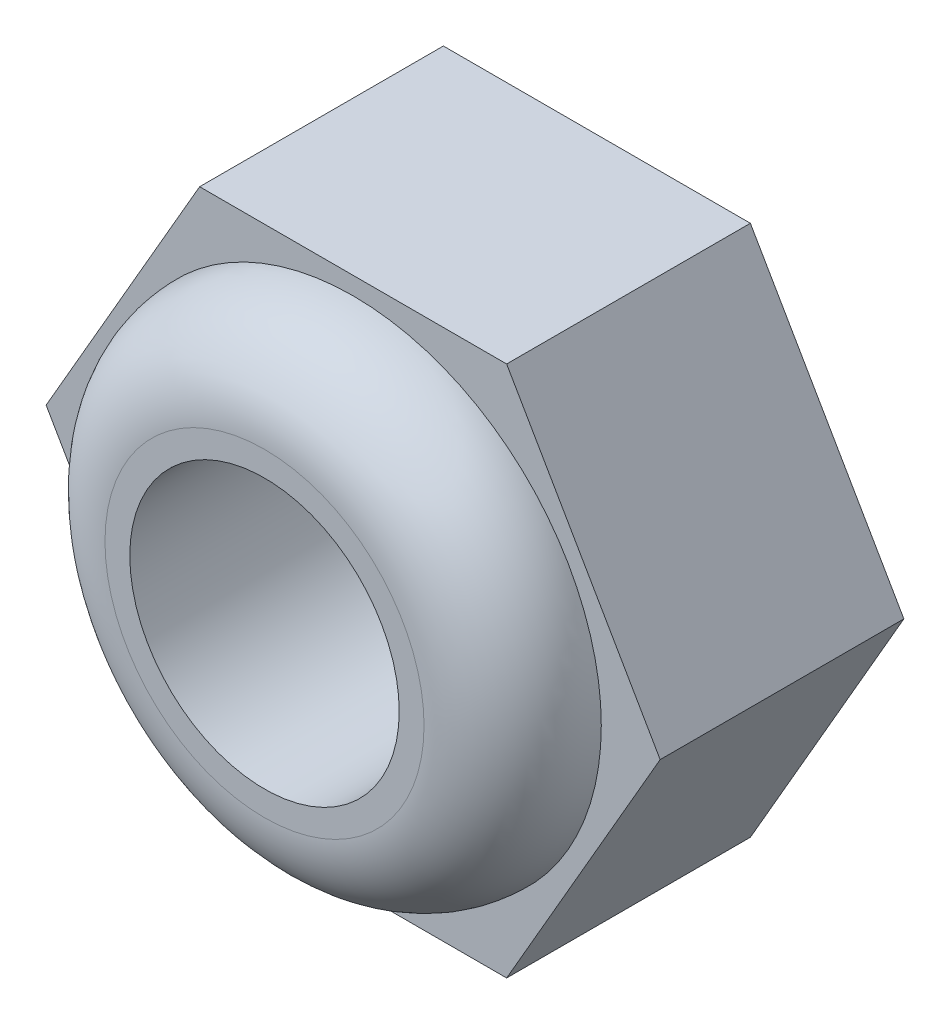
ISO-10303-21;
HEADER;
FILE_DESCRIPTION(('STEP AP214'),'2;1');
FILE_NAME('part.step','',(''),(''),'','','');
FILE_SCHEMA(('AUTOMOTIVE_DESIGN { 1 0 10303 214 1 1 1 1 }'));
ENDSEC;
DATA;
#1=APPLICATION_CONTEXT('core data for automotive mechanical design processes');
#2=APPLICATION_PROTOCOL_DEFINITION('international standard','automotive_design',2000,#1);
#3=PRODUCT_CONTEXT('',#1,'mechanical');
#4=PRODUCT('Part','Part','',(#3));
#5=PRODUCT_RELATED_PRODUCT_CATEGORY('part','',(#4));
#6=PRODUCT_DEFINITION_FORMATION('','',#4);
#7=PRODUCT_DEFINITION_CONTEXT('part definition',#1,'design');
#8=PRODUCT_DEFINITION('design','',#6,#7);
#9=PRODUCT_DEFINITION_SHAPE('','',#8);
#10=(LENGTH_UNIT() NAMED_UNIT(*) SI_UNIT(.MILLI.,.METRE.));
#11=(NAMED_UNIT(*) PLANE_ANGLE_UNIT() SI_UNIT($,.RADIAN.));
#12=(NAMED_UNIT(*) SI_UNIT($,.STERADIAN.) SOLID_ANGLE_UNIT());
#13=UNCERTAINTY_MEASURE_WITH_UNIT(LENGTH_MEASURE(1.E-05),#10,'distance_accuracy_value','');
#14=(GEOMETRIC_REPRESENTATION_CONTEXT(3) GLOBAL_UNCERTAINTY_ASSIGNED_CONTEXT((#13)) GLOBAL_UNIT_ASSIGNED_CONTEXT((#10,
#11,#12)) REPRESENTATION_CONTEXT('',''));
#15=CARTESIAN_POINT('',(0.,0.,0.));
#16=DIRECTION('',(0.,0.,1.));
#17=DIRECTION('',(1.,0.,0.));
#18=AXIS2_PLACEMENT_3D('',#15,#16,#17);
#19=CARTESIAN_POINT('',(0.,0.,4.365625));
#20=DIRECTION('',(0.,0.,1.));
#21=DIRECTION('',(1.,0.,0.));
#22=AXIS2_PLACEMENT_3D('',#19,#20,#21);
#23=PLANE('',#22);
#24=CARTESIAN_POINT('',(0.,0.,4.365625));
#25=DIRECTION('',(0.,0.,-1.));
#26=DIRECTION('',(-1.,0.,0.));
#27=AXIS2_PLACEMENT_3D('',#24,#25,#26);
#28=CIRCLE('',#27,4.445);
#29=CARTESIAN_POINT('',(-4.445,0.,4.365625));
#30=VERTEX_POINT('',#29);
#31=EDGE_CURVE('E20',#30,#30,#28,.F.);
#32=ORIENTED_EDGE('',*,*,#31,.F.);
#33=EDGE_LOOP('',(#32));
#34=FACE_BOUND('',#33,.T.);
#35=DIRECTION('',(0.5,-0.866025403784439,0.));
#36=VECTOR('',#35,1.);
#37=CARTESIAN_POINT('',(-2.7496306570156,-4.7625,4.365625));
#38=LINE('',#37,#36);
#39=CARTESIAN_POINT('',(-2.7496306570156,-4.7625,4.365625));
#40=VERTEX_POINT('',#39);
#41=CARTESIAN_POINT('',(-5.49926131403119,0.,4.365625));
#42=VERTEX_POINT('',#41);
#43=EDGE_CURVE('E67',#40,#42,#38,.F.);
#44=ORIENTED_EDGE('',*,*,#43,.F.);
#45=DIRECTION('',(1.,0.,0.));
#46=VECTOR('',#45,1.);
#47=CARTESIAN_POINT('',(2.7496306570156,-4.7625,4.365625));
#48=LINE('',#47,#46);
#49=CARTESIAN_POINT('',(2.7496306570156,-4.7625,4.365625));
#50=VERTEX_POINT('',#49);
#51=EDGE_CURVE('E189',#50,#40,#48,.F.);
#52=ORIENTED_EDGE('',*,*,#51,.F.);
#53=DIRECTION('',(0.5,0.866025403784439,0.));
#54=VECTOR('',#53,1.);
#55=CARTESIAN_POINT('',(5.49926131403119,0.,4.365625));
#56=LINE('',#55,#54);
#57=CARTESIAN_POINT('',(5.49926131403119,0.,4.365625));
#58=VERTEX_POINT('',#57);
#59=EDGE_CURVE('E190',#58,#50,#56,.F.);
#60=ORIENTED_EDGE('',*,*,#59,.F.);
#61=DIRECTION('',(-0.5,0.866025403784439,0.));
#62=VECTOR('',#61,1.);
#63=CARTESIAN_POINT('',(2.7496306570156,4.7625,4.365625));
#64=LINE('',#63,#62);
#65=CARTESIAN_POINT('',(2.7496306570156,4.7625,4.365625));
#66=VERTEX_POINT('',#65);
#67=EDGE_CURVE('E85',#66,#58,#64,.F.);
#68=ORIENTED_EDGE('',*,*,#67,.F.);
#69=DIRECTION('',(1.,0.,0.));
#70=VECTOR('',#69,1.);
#71=CARTESIAN_POINT('',(-2.7496306570156,4.7625,4.365625));
#72=LINE('',#71,#70);
#73=CARTESIAN_POINT('',(-2.7496306570156,4.7625,4.365625));
#74=VERTEX_POINT('',#73);
#75=EDGE_CURVE('E81',#74,#66,#72,.T.);
#76=ORIENTED_EDGE('',*,*,#75,.F.);
#77=DIRECTION('',(-0.5,-0.866025403784439,0.));
#78=VECTOR('',#77,1.);
#79=CARTESIAN_POINT('',(-5.49926131403119,0.,4.365625));
#80=LINE('',#79,#78);
#81=EDGE_CURVE('E72',#42,#74,#80,.F.);
#82=ORIENTED_EDGE('',*,*,#81,.F.);
#83=EDGE_LOOP('',(#44,#52,#60,#68,#76,#82));
#84=FACE_BOUND('',#83,.T.);
#85=ADVANCED_FACE('F17',(#34,#84),#23,.T.);
#86=CARTESIAN_POINT('',(0.,0.,4.365625));
#87=DIRECTION('',(0.,0.,-1.));
#88=DIRECTION('',(-1.,0.,0.));
#89=AXIS2_PLACEMENT_3D('',#86,#87,#88);
#90=TOROIDAL_SURFACE('',#89,2.8575,1.5875);
#91=ORIENTED_EDGE('',*,*,#31,.T.);
#92=EDGE_LOOP('',(#91));
#93=FACE_BOUND('',#92,.T.);
#94=CARTESIAN_POINT('',(0.,0.,5.953125));
#95=DIRECTION('',(0.,0.,-1.));
#96=DIRECTION('',(1.,0.,0.));
#97=AXIS2_PLACEMENT_3D('',#94,#95,#96);
#98=CIRCLE('',#97,2.8575);
#99=CARTESIAN_POINT('',(2.8575,0.,5.953125));
#100=VERTEX_POINT('',#99);
#101=EDGE_CURVE('E132',#100,#100,#98,.T.);
#102=ORIENTED_EDGE('',*,*,#101,.T.);
#103=EDGE_LOOP('',(#102));
#104=FACE_BOUND('',#103,.T.);
#105=ADVANCED_FACE('F101',(#93,#104),#90,.T.);
#106=CARTESIAN_POINT('',(-2.7496306570156,4.7625,0.));
#107=DIRECTION('',(0.,1.,0.));
#108=DIRECTION('',(0.,0.,1.));
#109=AXIS2_PLACEMENT_3D('',#106,#107,#108);
#110=PLANE('',#109);
#111=DIRECTION('',(1.,0.,0.));
#112=VECTOR('',#111,1.);
#113=CARTESIAN_POINT('',(0.,4.7625,0.));
#114=LINE('',#113,#112);
#115=CARTESIAN_POINT('',(2.7496306570156,4.7625,0.));
#116=VERTEX_POINT('',#115);
#117=CARTESIAN_POINT('',(-2.7496306570156,4.7625,0.));
#118=VERTEX_POINT('',#117);
#119=EDGE_CURVE('E92',#116,#118,#114,.F.);
#120=ORIENTED_EDGE('',*,*,#119,.T.);
#121=DIRECTION('',(0.,0.,1.));
#122=VECTOR('',#121,1.);
#123=CARTESIAN_POINT('',(-2.7496306570156,4.7625,0.));
#124=LINE('',#123,#122);
#125=EDGE_CURVE('E77',#74,#118,#124,.F.);
#126=ORIENTED_EDGE('',*,*,#125,.F.);
#127=ORIENTED_EDGE('',*,*,#75,.T.);
#128=DIRECTION('',(0.,0.,1.));
#129=VECTOR('',#128,1.);
#130=CARTESIAN_POINT('',(2.7496306570156,4.7625,0.));
#131=LINE('',#130,#129);
#132=EDGE_CURVE('E140',#116,#66,#131,.T.);
#133=ORIENTED_EDGE('',*,*,#132,.F.);
#134=EDGE_LOOP('',(#120,#126,#127,#133));
#135=FACE_BOUND('',#134,.T.);
#136=ADVANCED_FACE('F91',(#135),#110,.T.);
#137=CARTESIAN_POINT('',(-5.49926131403119,0.,0.));
#138=DIRECTION('',(-0.866025403784439,0.5,0.));
#139=DIRECTION('',(-0.5,-0.866025403784439,0.));
#140=AXIS2_PLACEMENT_3D('',#137,#138,#139);
#141=PLANE('',#140);
#142=DIRECTION('',(-0.500000000000001,-0.866025403784438,0.));
#143=VECTOR('',#142,1.);
#144=CARTESIAN_POINT('',(-2.7496306570156,4.7625,0.));
#145=LINE('',#144,#143);
#146=CARTESIAN_POINT('',(-5.49926131403119,0.,0.));
#147=VERTEX_POINT('',#146);
#148=EDGE_CURVE('E129',#118,#147,#145,.T.);
#149=ORIENTED_EDGE('',*,*,#148,.T.);
#150=DIRECTION('',(0.,0.,1.));
#151=VECTOR('',#150,1.);
#152=CARTESIAN_POINT('',(-5.49926131403119,0.,0.));
#153=LINE('',#152,#151);
#154=EDGE_CURVE('E79',#42,#147,#153,.F.);
#155=ORIENTED_EDGE('',*,*,#154,.F.);
#156=ORIENTED_EDGE('',*,*,#81,.T.);
#157=ORIENTED_EDGE('',*,*,#125,.T.);
#158=EDGE_LOOP('',(#149,#155,#156,#157));
#159=FACE_BOUND('',#158,.T.);
#160=ADVANCED_FACE('F75',(#159),#141,.T.);
#161=CARTESIAN_POINT('',(-2.7496306570156,-4.7625,0.));
#162=DIRECTION('',(-0.866025403784439,-0.5,0.));
#163=DIRECTION('',(0.5,-0.866025403784439,0.));
#164=AXIS2_PLACEMENT_3D('',#161,#162,#163);
#165=PLANE('',#164);
#166=DIRECTION('',(0.5,-0.866025403784438,0.));
#167=VECTOR('',#166,1.);
#168=CARTESIAN_POINT('',(-5.49926131403119,0.,0.));
#169=LINE('',#168,#167);
#170=CARTESIAN_POINT('',(-2.7496306570156,-4.7625,0.));
#171=VERTEX_POINT('',#170);
#172=EDGE_CURVE('E126',#147,#171,#169,.T.);
#173=ORIENTED_EDGE('',*,*,#172,.T.);
#174=DIRECTION('',(0.,0.,-1.));
#175=VECTOR('',#174,1.);
#176=CARTESIAN_POINT('',(-2.7496306570156,-4.7625,0.));
#177=LINE('',#176,#175);
#178=EDGE_CURVE('E187',#40,#171,#177,.T.);
#179=ORIENTED_EDGE('',*,*,#178,.F.);
#180=ORIENTED_EDGE('',*,*,#43,.T.);
#181=ORIENTED_EDGE('',*,*,#154,.T.);
#182=EDGE_LOOP('',(#173,#179,#180,#181));
#183=FACE_BOUND('',#182,.T.);
#184=ADVANCED_FACE('F164',(#183),#165,.T.);
#185=CARTESIAN_POINT('',(2.7496306570156,-4.7625,0.));
#186=DIRECTION('',(0.,-1.,0.));
#187=DIRECTION('',(0.,0.,-1.));
#188=AXIS2_PLACEMENT_3D('',#185,#186,#187);
#189=PLANE('',#188);
#190=DIRECTION('',(1.,0.,0.));
#191=VECTOR('',#190,1.);
#192=CARTESIAN_POINT('',(0.,-4.7625,0.));
#193=LINE('',#192,#191);
#194=CARTESIAN_POINT('',(2.7496306570156,-4.7625,0.));
#195=VERTEX_POINT('',#194);
#196=EDGE_CURVE('E121',#171,#195,#193,.T.);
#197=ORIENTED_EDGE('',*,*,#196,.T.);
#198=DIRECTION('',(0.,0.,1.));
#199=VECTOR('',#198,1.);
#200=CARTESIAN_POINT('',(2.7496306570156,-4.7625,0.));
#201=LINE('',#200,#199);
#202=EDGE_CURVE('E186',#50,#195,#201,.F.);
#203=ORIENTED_EDGE('',*,*,#202,.F.);
#204=ORIENTED_EDGE('',*,*,#51,.T.);
#205=ORIENTED_EDGE('',*,*,#178,.T.);
#206=EDGE_LOOP('',(#197,#203,#204,#205));
#207=FACE_BOUND('',#206,.T.);
#208=ADVANCED_FACE('F160',(#207),#189,.T.);
#209=CARTESIAN_POINT('',(5.49926131403119,0.,0.));
#210=DIRECTION('',(0.866025403784439,-0.5,0.));
#211=DIRECTION('',(0.5,0.866025403784439,0.));
#212=AXIS2_PLACEMENT_3D('',#209,#210,#211);
#213=PLANE('',#212);
#214=DIRECTION('',(0.5,0.866025403784438,0.));
#215=VECTOR('',#214,1.);
#216=CARTESIAN_POINT('',(2.7496306570156,-4.7625,0.));
#217=LINE('',#216,#215);
#218=CARTESIAN_POINT('',(5.49926131403119,0.,0.));
#219=VERTEX_POINT('',#218);
#220=EDGE_CURVE('E118',#195,#219,#217,.T.);
#221=ORIENTED_EDGE('',*,*,#220,.T.);
#222=DIRECTION('',(0.,0.,1.));
#223=VECTOR('',#222,1.);
#224=CARTESIAN_POINT('',(5.49926131403119,0.,0.));
#225=LINE('',#224,#223);
#226=EDGE_CURVE('E35',#58,#219,#225,.F.);
#227=ORIENTED_EDGE('',*,*,#226,.F.);
#228=ORIENTED_EDGE('',*,*,#59,.T.);
#229=ORIENTED_EDGE('',*,*,#202,.T.);
#230=EDGE_LOOP('',(#221,#227,#228,#229));
#231=FACE_BOUND('',#230,.T.);
#232=ADVANCED_FACE('F157',(#231),#213,.T.);
#233=CARTESIAN_POINT('',(2.7496306570156,4.7625,0.));
#234=DIRECTION('',(0.866025403784439,0.5,0.));
#235=DIRECTION('',(-0.5,0.866025403784439,0.));
#236=AXIS2_PLACEMENT_3D('',#233,#234,#235);
#237=PLANE('',#236);
#238=DIRECTION('',(-0.500000000000001,0.866025403784438,0.));
#239=VECTOR('',#238,1.);
#240=CARTESIAN_POINT('',(5.49926131403119,0.,0.));
#241=LINE('',#240,#239);
#242=EDGE_CURVE('E115',#219,#116,#241,.T.);
#243=ORIENTED_EDGE('',*,*,#242,.T.);
#244=ORIENTED_EDGE('',*,*,#132,.T.);
#245=ORIENTED_EDGE('',*,*,#67,.T.);
#246=ORIENTED_EDGE('',*,*,#226,.T.);
#247=EDGE_LOOP('',(#243,#244,#245,#246));
#248=FACE_BOUND('',#247,.T.);
#249=ADVANCED_FACE('F153',(#248),#237,.T.);
#250=CARTESIAN_POINT('',(0.,0.,5.953125));
#251=DIRECTION('',(0.,0.,-1.));
#252=DIRECTION('',(-1.,0.,0.));
#253=AXIS2_PLACEMENT_3D('',#250,#251,#252);
#254=PLANE('',#253);
#255=CARTESIAN_POINT('',(0.,0.,5.953125));
#256=DIRECTION('',(0.,0.,1.));
#257=DIRECTION('',(1.,0.,0.));
#258=AXIS2_PLACEMENT_3D('',#255,#256,#257);
#259=CIRCLE('',#258,2.413);
#260=CARTESIAN_POINT('',(2.413,0.,5.953125));
#261=VERTEX_POINT('',#260);
#262=EDGE_CURVE('E26',#261,#261,#259,.F.);
#263=ORIENTED_EDGE('',*,*,#262,.T.);
#264=EDGE_LOOP('',(#263));
#265=FACE_BOUND('',#264,.T.);
#266=ORIENTED_EDGE('',*,*,#101,.F.);
#267=EDGE_LOOP('',(#266));
#268=FACE_BOUND('',#267,.T.);
#269=ADVANCED_FACE('F142',(#265,#268),#254,.F.);
#270=CARTESIAN_POINT('',(0.,0.,0.));
#271=DIRECTION('',(0.,0.,1.));
#272=DIRECTION('',(1.,0.,0.));
#273=AXIS2_PLACEMENT_3D('',#270,#271,#272);
#274=PLANE('',#273);
#275=CARTESIAN_POINT('',(0.,0.,0.));
#276=DIRECTION('',(0.,0.,1.));
#277=DIRECTION('',(1.,0.,0.));
#278=AXIS2_PLACEMENT_3D('',#275,#276,#277);
#279=CIRCLE('',#278,2.413);
#280=CARTESIAN_POINT('',(2.413,0.,0.));
#281=VERTEX_POINT('',#280);
#282=EDGE_CURVE('E11',#281,#281,#279,.T.);
#283=ORIENTED_EDGE('',*,*,#282,.T.);
#284=EDGE_LOOP('',(#283));
#285=FACE_BOUND('',#284,.T.);
#286=ORIENTED_EDGE('',*,*,#220,.F.);
#287=ORIENTED_EDGE('',*,*,#196,.F.);
#288=ORIENTED_EDGE('',*,*,#172,.F.);
#289=ORIENTED_EDGE('',*,*,#148,.F.);
#290=ORIENTED_EDGE('',*,*,#119,.F.);
#291=ORIENTED_EDGE('',*,*,#242,.F.);
#292=EDGE_LOOP('',(#286,#287,#288,#289,#290,#291));
#293=FACE_BOUND('',#292,.T.);
#294=ADVANCED_FACE('F152',(#285,#293),#274,.F.);
#295=CARTESIAN_POINT('',(0.,0.,0.));
#296=DIRECTION('',(0.,0.,1.));
#297=DIRECTION('',(1.,0.,0.));
#298=AXIS2_PLACEMENT_3D('',#295,#296,#297);
#299=CYLINDRICAL_SURFACE('',#298,2.413);
#300=ORIENTED_EDGE('',*,*,#282,.F.);
#301=EDGE_LOOP('',(#300));
#302=FACE_BOUND('',#301,.T.);
#303=ORIENTED_EDGE('',*,*,#262,.F.);
#304=EDGE_LOOP('',(#303));
#305=FACE_BOUND('',#304,.T.);
#306=ADVANCED_FACE('F172',(#302,#305),#299,.F.);
#307=CLOSED_SHELL('',(#85,#105,#136,#160,#184,#208,#232,#249,#269,#294,#306));
#308=MANIFOLD_SOLID_BREP('B1',#307);
#309=ADVANCED_BREP_SHAPE_REPRESENTATION('',(#18,#308),#14);
#310=SHAPE_DEFINITION_REPRESENTATION(#9,#309);
ENDSEC;
END-ISO-10303-21;
